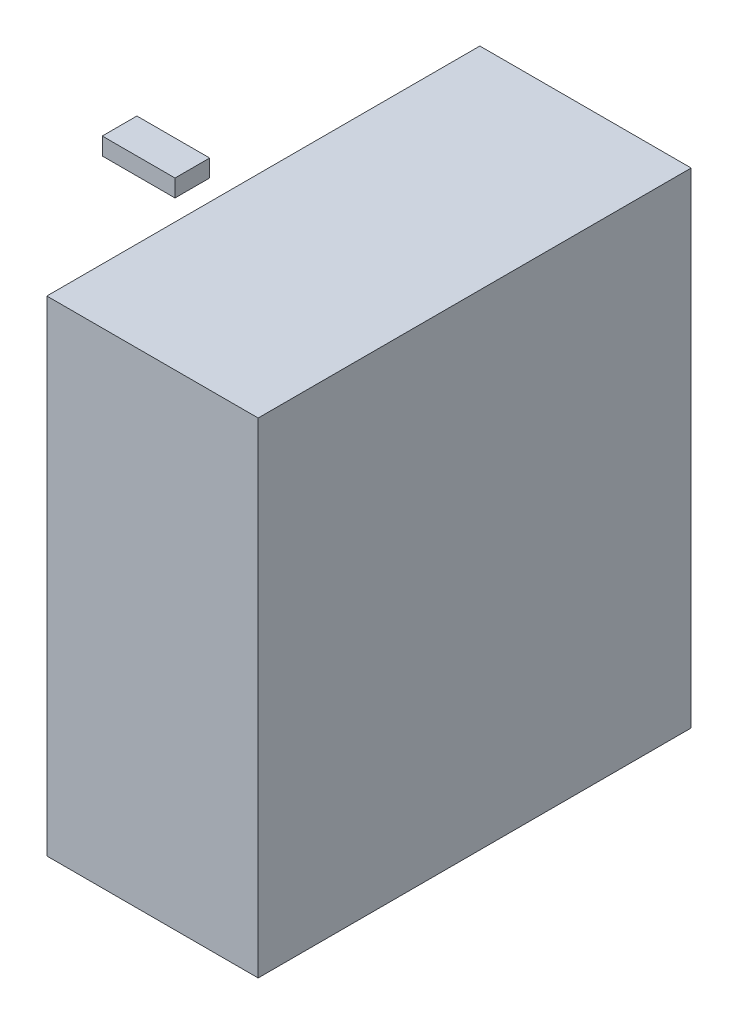
ISO-10303-21;
HEADER;
FILE_DESCRIPTION(('STEP AP214'),'2;1');
FILE_NAME('part.step','',(''),(''),'','','');
FILE_SCHEMA(('AUTOMOTIVE_DESIGN { 1 0 10303 214 1 1 1 1 }'));
ENDSEC;
DATA;
#1=APPLICATION_CONTEXT('core data for automotive mechanical design processes');
#2=APPLICATION_PROTOCOL_DEFINITION('international standard','automotive_design',2000,#1);
#3=PRODUCT_CONTEXT('',#1,'mechanical');
#4=PRODUCT('Part','Part','',(#3));
#5=PRODUCT_RELATED_PRODUCT_CATEGORY('part','',(#4));
#6=PRODUCT_DEFINITION_FORMATION('','',#4);
#7=PRODUCT_DEFINITION_CONTEXT('part definition',#1,'design');
#8=PRODUCT_DEFINITION('design','',#6,#7);
#9=PRODUCT_DEFINITION_SHAPE('','',#8);
#10=(LENGTH_UNIT() NAMED_UNIT(*) SI_UNIT(.MILLI.,.METRE.));
#11=(NAMED_UNIT(*) PLANE_ANGLE_UNIT() SI_UNIT($,.RADIAN.));
#12=(NAMED_UNIT(*) SI_UNIT($,.STERADIAN.) SOLID_ANGLE_UNIT());
#13=UNCERTAINTY_MEASURE_WITH_UNIT(LENGTH_MEASURE(1.E-05),#10,'distance_accuracy_value','');
#14=(GEOMETRIC_REPRESENTATION_CONTEXT(3) GLOBAL_UNCERTAINTY_ASSIGNED_CONTEXT((#13)) GLOBAL_UNIT_ASSIGNED_CONTEXT((#10,
#11,#12)) REPRESENTATION_CONTEXT('',''));
#15=CARTESIAN_POINT('',(0.,0.,0.));
#16=DIRECTION('',(0.,0.,1.));
#17=DIRECTION('',(1.,0.,0.));
#18=AXIS2_PLACEMENT_3D('',#15,#16,#17);
#19=CARTESIAN_POINT('',(0.,15.1,0.));
#20=DIRECTION('',(1.,0.,0.));
#21=DIRECTION('',(0.,0.,-1.));
#22=AXIS2_PLACEMENT_3D('',#19,#20,#21);
#23=PLANE('',#22);
#24=DIRECTION('',(0.,0.,1.));
#25=VECTOR('',#24,1.);
#26=CARTESIAN_POINT('',(0.,14.6,0.));
#27=LINE('',#26,#25);
#28=CARTESIAN_POINT('',(0.,14.6,7.8));
#29=VERTEX_POINT('',#28);
#30=CARTESIAN_POINT('',(0.,14.6,8.8));
#31=VERTEX_POINT('',#30);
#32=EDGE_CURVE('E114',#29,#31,#27,.T.);
#33=ORIENTED_EDGE('',*,*,#32,.F.);
#34=DIRECTION('',(0.,-1.,0.));
#35=VECTOR('',#34,1.);
#36=CARTESIAN_POINT('',(0.,15.1,7.8));
#37=LINE('',#36,#35);
#38=CARTESIAN_POINT('',(0.,15.1,7.8));
#39=VERTEX_POINT('',#38);
#40=EDGE_CURVE('E12',#39,#29,#37,.T.);
#41=ORIENTED_EDGE('',*,*,#40,.F.);
#42=DIRECTION('',(0.,0.,1.));
#43=VECTOR('',#42,1.);
#44=CARTESIAN_POINT('',(0.,15.1,0.));
#45=LINE('',#44,#43);
#46=CARTESIAN_POINT('',(0.,15.1,8.8));
#47=VERTEX_POINT('',#46);
#48=EDGE_CURVE('E108',#39,#47,#45,.T.);
#49=ORIENTED_EDGE('',*,*,#48,.T.);
#50=DIRECTION('',(0.,-1.,0.));
#51=VECTOR('',#50,1.);
#52=CARTESIAN_POINT('',(0.,15.1,8.8));
#53=LINE('',#52,#51);
#54=EDGE_CURVE('E89',#47,#31,#53,.T.);
#55=ORIENTED_EDGE('',*,*,#54,.T.);
#56=EDGE_LOOP('',(#33,#41,#49,#55));
#57=FACE_BOUND('',#56,.T.);
#58=ADVANCED_FACE('F51',(#57),#23,.T.);
#59=CARTESIAN_POINT('',(0.,15.1,7.8));
#60=DIRECTION('',(0.,0.,-1.));
#61=DIRECTION('',(-1.,0.,0.));
#62=AXIS2_PLACEMENT_3D('',#59,#60,#61);
#63=PLANE('',#62);
#64=DIRECTION('',(1.,0.,0.));
#65=VECTOR('',#64,1.);
#66=CARTESIAN_POINT('',(0.,14.6,7.8));
#67=LINE('',#66,#65);
#68=CARTESIAN_POINT('',(-2.1,14.6,7.8));
#69=VERTEX_POINT('',#68);
#70=EDGE_CURVE('E102',#69,#29,#67,.T.);
#71=ORIENTED_EDGE('',*,*,#70,.F.);
#72=DIRECTION('',(0.,-1.,0.));
#73=VECTOR('',#72,1.);
#74=CARTESIAN_POINT('',(-2.1,15.1,7.8));
#75=LINE('',#74,#73);
#76=CARTESIAN_POINT('',(-2.1,15.1,7.8));
#77=VERTEX_POINT('',#76);
#78=EDGE_CURVE('E59',#77,#69,#75,.T.);
#79=ORIENTED_EDGE('',*,*,#78,.F.);
#80=DIRECTION('',(1.,0.,0.));
#81=VECTOR('',#80,1.);
#82=CARTESIAN_POINT('',(0.,15.1,7.8));
#83=LINE('',#82,#81);
#84=EDGE_CURVE('E100',#77,#39,#83,.T.);
#85=ORIENTED_EDGE('',*,*,#84,.T.);
#86=ORIENTED_EDGE('',*,*,#40,.T.);
#87=EDGE_LOOP('',(#71,#79,#85,#86));
#88=FACE_BOUND('',#87,.T.);
#89=ADVANCED_FACE('F98',(#88),#63,.T.);
#90=CARTESIAN_POINT('',(-2.1,15.1,0.));
#91=DIRECTION('',(1.,0.,0.));
#92=DIRECTION('',(0.,0.,-1.));
#93=AXIS2_PLACEMENT_3D('',#90,#91,#92);
#94=PLANE('',#93);
#95=DIRECTION('',(0.,0.,1.));
#96=VECTOR('',#95,1.);
#97=CARTESIAN_POINT('',(-2.1,14.6,0.));
#98=LINE('',#97,#96);
#99=CARTESIAN_POINT('',(-2.1,14.6,8.8));
#100=VERTEX_POINT('',#99);
#101=EDGE_CURVE('E82',#69,#100,#98,.T.);
#102=ORIENTED_EDGE('',*,*,#101,.T.);
#103=DIRECTION('',(0.,-1.,0.));
#104=VECTOR('',#103,1.);
#105=CARTESIAN_POINT('',(-2.1,15.1,8.8));
#106=LINE('',#105,#104);
#107=CARTESIAN_POINT('',(-2.1,15.1,8.8));
#108=VERTEX_POINT('',#107);
#109=EDGE_CURVE('E103',#108,#100,#106,.T.);
#110=ORIENTED_EDGE('',*,*,#109,.F.);
#111=DIRECTION('',(0.,0.,1.));
#112=VECTOR('',#111,1.);
#113=CARTESIAN_POINT('',(-2.1,15.1,0.));
#114=LINE('',#113,#112);
#115=EDGE_CURVE('E104',#77,#108,#114,.T.);
#116=ORIENTED_EDGE('',*,*,#115,.F.);
#117=ORIENTED_EDGE('',*,*,#78,.T.);
#118=EDGE_LOOP('',(#102,#110,#116,#117));
#119=FACE_BOUND('',#118,.T.);
#120=ADVANCED_FACE('F105',(#119),#94,.F.);
#121=CARTESIAN_POINT('',(0.,15.1,8.8));
#122=DIRECTION('',(0.,0.,-1.));
#123=DIRECTION('',(-1.,0.,0.));
#124=AXIS2_PLACEMENT_3D('',#121,#122,#123);
#125=PLANE('',#124);
#126=DIRECTION('',(1.,0.,0.));
#127=VECTOR('',#126,1.);
#128=CARTESIAN_POINT('',(0.,14.6,8.8));
#129=LINE('',#128,#127);
#130=EDGE_CURVE('E110',#100,#31,#129,.T.);
#131=ORIENTED_EDGE('',*,*,#130,.T.);
#132=ORIENTED_EDGE('',*,*,#54,.F.);
#133=DIRECTION('',(1.,0.,0.));
#134=VECTOR('',#133,1.);
#135=CARTESIAN_POINT('',(0.,15.1,8.8));
#136=LINE('',#135,#134);
#137=EDGE_CURVE('E67',#108,#47,#136,.T.);
#138=ORIENTED_EDGE('',*,*,#137,.F.);
#139=ORIENTED_EDGE('',*,*,#109,.T.);
#140=EDGE_LOOP('',(#131,#132,#138,#139));
#141=FACE_BOUND('',#140,.T.);
#142=ADVANCED_FACE('F123',(#141),#125,.F.);
#143=CARTESIAN_POINT('',(0.,15.1,0.));
#144=DIRECTION('',(0.,1.,0.));
#145=DIRECTION('',(0.,0.,1.));
#146=AXIS2_PLACEMENT_3D('',#143,#144,#145);
#147=PLANE('',#146);
#148=ORIENTED_EDGE('',*,*,#48,.F.);
#149=ORIENTED_EDGE('',*,*,#84,.F.);
#150=ORIENTED_EDGE('',*,*,#115,.T.);
#151=ORIENTED_EDGE('',*,*,#137,.T.);
#152=EDGE_LOOP('',(#148,#149,#150,#151));
#153=FACE_BOUND('',#152,.T.);
#154=ADVANCED_FACE('F107',(#153),#147,.T.);
#155=CARTESIAN_POINT('',(0.,14.6,0.));
#156=DIRECTION('',(0.,1.,0.));
#157=DIRECTION('',(0.,0.,1.));
#158=AXIS2_PLACEMENT_3D('',#155,#156,#157);
#159=PLANE('',#158);
#160=ORIENTED_EDGE('',*,*,#32,.T.);
#161=ORIENTED_EDGE('',*,*,#130,.F.);
#162=ORIENTED_EDGE('',*,*,#101,.F.);
#163=ORIENTED_EDGE('',*,*,#70,.T.);
#164=EDGE_LOOP('',(#160,#161,#162,#163));
#165=FACE_BOUND('',#164,.T.);
#166=ADVANCED_FACE('F125',(#165),#159,.F.);
#167=CLOSED_SHELL('',(#58,#89,#120,#142,#154,#166));
#168=MANIFOLD_SOLID_BREP('B2',#167);
#169=CARTESIAN_POINT('',(0.,-1.1,0.));
#170=DIRECTION('',(-1.,0.,0.));
#171=DIRECTION('',(0.,0.,1.));
#172=AXIS2_PLACEMENT_3D('',#169,#170,#171);
#173=PLANE('',#172);
#174=DIRECTION('',(0.,0.,1.));
#175=VECTOR('',#174,1.);
#176=CARTESIAN_POINT('',(0.,-0.6,0.));
#177=LINE('',#176,#175);
#178=CARTESIAN_POINT('',(0.,-0.6,7.8));
#179=VERTEX_POINT('',#178);
#180=CARTESIAN_POINT('',(0.,-0.6,8.8));
#181=VERTEX_POINT('',#180);
#182=EDGE_CURVE('E260',#179,#181,#177,.T.);
#183=ORIENTED_EDGE('',*,*,#182,.T.);
#184=DIRECTION('',(0.,1.,0.));
#185=VECTOR('',#184,1.);
#186=CARTESIAN_POINT('',(0.,-1.1,8.8));
#187=LINE('',#186,#185);
#188=CARTESIAN_POINT('',(0.,-1.1,8.8));
#189=VERTEX_POINT('',#188);
#190=EDGE_CURVE('E49',#189,#181,#187,.T.);
#191=ORIENTED_EDGE('',*,*,#190,.F.);
#192=DIRECTION('',(0.,0.,1.));
#193=VECTOR('',#192,1.);
#194=CARTESIAN_POINT('',(0.,-1.1,0.));
#195=LINE('',#194,#193);
#196=CARTESIAN_POINT('',(0.,-1.1,7.8));
#197=VERTEX_POINT('',#196);
#198=EDGE_CURVE('E216',#197,#189,#195,.T.);
#199=ORIENTED_EDGE('',*,*,#198,.F.);
#200=DIRECTION('',(0.,1.,0.));
#201=VECTOR('',#200,1.);
#202=CARTESIAN_POINT('',(0.,-1.1,7.8));
#203=LINE('',#202,#201);
#204=EDGE_CURVE('E201',#197,#179,#203,.T.);
#205=ORIENTED_EDGE('',*,*,#204,.T.);
#206=EDGE_LOOP('',(#183,#191,#199,#205));
#207=FACE_BOUND('',#206,.T.);
#208=ADVANCED_FACE('F198',(#207),#173,.F.);
#209=CARTESIAN_POINT('',(0.,-1.1,8.8));
#210=DIRECTION('',(0.,0.,1.));
#211=DIRECTION('',(1.,0.,0.));
#212=AXIS2_PLACEMENT_3D('',#209,#210,#211);
#213=PLANE('',#212);
#214=DIRECTION('',(1.,0.,0.));
#215=VECTOR('',#214,1.);
#216=CARTESIAN_POINT('',(0.,-0.6,8.8));
#217=LINE('',#216,#215);
#218=CARTESIAN_POINT('',(-2.1,-0.6,8.8));
#219=VERTEX_POINT('',#218);
#220=EDGE_CURVE('E265',#219,#181,#217,.T.);
#221=ORIENTED_EDGE('',*,*,#220,.F.);
#222=DIRECTION('',(0.,1.,0.));
#223=VECTOR('',#222,1.);
#224=CARTESIAN_POINT('',(-2.1,-1.1,8.8));
#225=LINE('',#224,#223);
#226=CARTESIAN_POINT('',(-2.1,-1.1,8.8));
#227=VERTEX_POINT('',#226);
#228=EDGE_CURVE('E207',#227,#219,#225,.T.);
#229=ORIENTED_EDGE('',*,*,#228,.F.);
#230=DIRECTION('',(1.,0.,0.));
#231=VECTOR('',#230,1.);
#232=CARTESIAN_POINT('',(0.,-1.1,8.8));
#233=LINE('',#232,#231);
#234=EDGE_CURVE('E255',#227,#189,#233,.T.);
#235=ORIENTED_EDGE('',*,*,#234,.T.);
#236=ORIENTED_EDGE('',*,*,#190,.T.);
#237=EDGE_LOOP('',(#221,#229,#235,#236));
#238=FACE_BOUND('',#237,.T.);
#239=ADVANCED_FACE('F271',(#238),#213,.T.);
#240=CARTESIAN_POINT('',(-2.1,-1.1,0.));
#241=DIRECTION('',(-1.,0.,0.));
#242=DIRECTION('',(0.,0.,1.));
#243=AXIS2_PLACEMENT_3D('',#240,#241,#242);
#244=PLANE('',#243);
#245=DIRECTION('',(0.,0.,1.));
#246=VECTOR('',#245,1.);
#247=CARTESIAN_POINT('',(-2.1,-0.6,0.));
#248=LINE('',#247,#246);
#249=CARTESIAN_POINT('',(-2.1,-0.6,7.8));
#250=VERTEX_POINT('',#249);
#251=EDGE_CURVE('E248',#250,#219,#248,.T.);
#252=ORIENTED_EDGE('',*,*,#251,.F.);
#253=DIRECTION('',(0.,1.,0.));
#254=VECTOR('',#253,1.);
#255=CARTESIAN_POINT('',(-2.1,-1.1,7.8));
#256=LINE('',#255,#254);
#257=CARTESIAN_POINT('',(-2.1,-1.1,7.8));
#258=VERTEX_POINT('',#257);
#259=EDGE_CURVE('E245',#258,#250,#256,.T.);
#260=ORIENTED_EDGE('',*,*,#259,.F.);
#261=DIRECTION('',(0.,0.,1.));
#262=VECTOR('',#261,1.);
#263=CARTESIAN_POINT('',(-2.1,-1.1,0.));
#264=LINE('',#263,#262);
#265=EDGE_CURVE('E247',#258,#227,#264,.T.);
#266=ORIENTED_EDGE('',*,*,#265,.T.);
#267=ORIENTED_EDGE('',*,*,#228,.T.);
#268=EDGE_LOOP('',(#252,#260,#266,#267));
#269=FACE_BOUND('',#268,.T.);
#270=ADVANCED_FACE('F246',(#269),#244,.T.);
#271=CARTESIAN_POINT('',(0.,-1.1,7.8));
#272=DIRECTION('',(0.,0.,1.));
#273=DIRECTION('',(1.,0.,0.));
#274=AXIS2_PLACEMENT_3D('',#271,#272,#273);
#275=PLANE('',#274);
#276=DIRECTION('',(1.,0.,0.));
#277=VECTOR('',#276,1.);
#278=CARTESIAN_POINT('',(0.,-0.6,7.8));
#279=LINE('',#278,#277);
#280=EDGE_CURVE('E262',#250,#179,#279,.T.);
#281=ORIENTED_EDGE('',*,*,#280,.T.);
#282=ORIENTED_EDGE('',*,*,#204,.F.);
#283=DIRECTION('',(1.,0.,0.));
#284=VECTOR('',#283,1.);
#285=CARTESIAN_POINT('',(0.,-1.1,7.8));
#286=LINE('',#285,#284);
#287=EDGE_CURVE('E242',#258,#197,#286,.T.);
#288=ORIENTED_EDGE('',*,*,#287,.F.);
#289=ORIENTED_EDGE('',*,*,#259,.T.);
#290=EDGE_LOOP('',(#281,#282,#288,#289));
#291=FACE_BOUND('',#290,.T.);
#292=ADVANCED_FACE('F251',(#291),#275,.F.);
#293=CARTESIAN_POINT('',(0.,-1.1,0.));
#294=DIRECTION('',(0.,1.,0.));
#295=DIRECTION('',(0.,0.,1.));
#296=AXIS2_PLACEMENT_3D('',#293,#294,#295);
#297=PLANE('',#296);
#298=ORIENTED_EDGE('',*,*,#198,.T.);
#299=ORIENTED_EDGE('',*,*,#234,.F.);
#300=ORIENTED_EDGE('',*,*,#265,.F.);
#301=ORIENTED_EDGE('',*,*,#287,.T.);
#302=EDGE_LOOP('',(#298,#299,#300,#301));
#303=FACE_BOUND('',#302,.T.);
#304=ADVANCED_FACE('F254',(#303),#297,.F.);
#305=CARTESIAN_POINT('',(0.,-0.6,0.));
#306=DIRECTION('',(0.,1.,0.));
#307=DIRECTION('',(0.,0.,1.));
#308=AXIS2_PLACEMENT_3D('',#305,#306,#307);
#309=PLANE('',#308);
#310=ORIENTED_EDGE('',*,*,#182,.F.);
#311=ORIENTED_EDGE('',*,*,#280,.F.);
#312=ORIENTED_EDGE('',*,*,#251,.T.);
#313=ORIENTED_EDGE('',*,*,#220,.T.);
#314=EDGE_LOOP('',(#310,#311,#312,#313));
#315=FACE_BOUND('',#314,.T.);
#316=ADVANCED_FACE('F270',(#315),#309,.T.);
#317=CLOSED_SHELL('',(#208,#239,#270,#292,#304,#316));
#318=MANIFOLD_SOLID_BREP('B6',#317);
#319=CARTESIAN_POINT('',(6.1,14.,0.));
#320=DIRECTION('',(1.,0.,0.));
#321=DIRECTION('',(0.,0.,-1.));
#322=AXIS2_PLACEMENT_3D('',#319,#320,#321);
#323=PLANE('',#322);
#324=DIRECTION('',(0.,0.,1.));
#325=VECTOR('',#324,1.);
#326=CARTESIAN_POINT('',(6.1,0.,0.));
#327=LINE('',#326,#325);
#328=CARTESIAN_POINT('',(6.1,0.,0.));
#329=VERTEX_POINT('',#328);
#330=CARTESIAN_POINT('',(6.1,0.,12.5));
#331=VERTEX_POINT('',#330);
#332=EDGE_CURVE('E399',#329,#331,#327,.T.);
#333=ORIENTED_EDGE('',*,*,#332,.F.);
#334=DIRECTION('',(0.,-1.,0.));
#335=VECTOR('',#334,1.);
#336=CARTESIAN_POINT('',(6.1,14.,0.));
#337=LINE('',#336,#335);
#338=CARTESIAN_POINT('',(6.1,14.,0.));
#339=VERTEX_POINT('',#338);
#340=EDGE_CURVE('E196',#339,#329,#337,.T.);
#341=ORIENTED_EDGE('',*,*,#340,.F.);
#342=DIRECTION('',(0.,0.,1.));
#343=VECTOR('',#342,1.);
#344=CARTESIAN_POINT('',(6.1,14.,0.));
#345=LINE('',#344,#343);
#346=CARTESIAN_POINT('',(6.1,14.,12.5));
#347=VERTEX_POINT('',#346);
#348=EDGE_CURVE('E393',#339,#347,#345,.T.);
#349=ORIENTED_EDGE('',*,*,#348,.T.);
#350=DIRECTION('',(0.,-1.,0.));
#351=VECTOR('',#350,1.);
#352=CARTESIAN_POINT('',(6.1,14.,12.5));
#353=LINE('',#352,#351);
#354=EDGE_CURVE('E374',#347,#331,#353,.T.);
#355=ORIENTED_EDGE('',*,*,#354,.T.);
#356=EDGE_LOOP('',(#333,#341,#349,#355));
#357=FACE_BOUND('',#356,.T.);
#358=ADVANCED_FACE('F336',(#357),#323,.T.);
#359=CARTESIAN_POINT('',(0.,14.,0.));
#360=DIRECTION('',(0.,0.,-1.));
#361=DIRECTION('',(-1.,0.,0.));
#362=AXIS2_PLACEMENT_3D('',#359,#360,#361);
#363=PLANE('',#362);
#364=DIRECTION('',(1.,0.,0.));
#365=VECTOR('',#364,1.);
#366=CARTESIAN_POINT('',(0.,0.,0.));
#367=LINE('',#366,#365);
#368=CARTESIAN_POINT('',(0.,0.,0.));
#369=VERTEX_POINT('',#368);
#370=EDGE_CURVE('E387',#369,#329,#367,.T.);
#371=ORIENTED_EDGE('',*,*,#370,.F.);
#372=DIRECTION('',(0.,-1.,0.));
#373=VECTOR('',#372,1.);
#374=CARTESIAN_POINT('',(0.,14.,0.));
#375=LINE('',#374,#373);
#376=CARTESIAN_POINT('',(0.,14.,0.));
#377=VERTEX_POINT('',#376);
#378=EDGE_CURVE('E344',#377,#369,#375,.T.);
#379=ORIENTED_EDGE('',*,*,#378,.F.);
#380=DIRECTION('',(1.,0.,0.));
#381=VECTOR('',#380,1.);
#382=CARTESIAN_POINT('',(0.,14.,0.));
#383=LINE('',#382,#381);
#384=EDGE_CURVE('E385',#377,#339,#383,.T.);
#385=ORIENTED_EDGE('',*,*,#384,.T.);
#386=ORIENTED_EDGE('',*,*,#340,.T.);
#387=EDGE_LOOP('',(#371,#379,#385,#386));
#388=FACE_BOUND('',#387,.T.);
#389=ADVANCED_FACE('F383',(#388),#363,.T.);
#390=CARTESIAN_POINT('',(0.,14.,0.));
#391=DIRECTION('',(1.,0.,0.));
#392=DIRECTION('',(0.,0.,-1.));
#393=AXIS2_PLACEMENT_3D('',#390,#391,#392);
#394=PLANE('',#393);
#395=DIRECTION('',(0.,0.,1.));
#396=VECTOR('',#395,1.);
#397=CARTESIAN_POINT('',(0.,0.,0.));
#398=LINE('',#397,#396);
#399=CARTESIAN_POINT('',(0.,0.,12.5));
#400=VERTEX_POINT('',#399);
#401=EDGE_CURVE('E367',#369,#400,#398,.T.);
#402=ORIENTED_EDGE('',*,*,#401,.T.);
#403=DIRECTION('',(0.,-1.,0.));
#404=VECTOR('',#403,1.);
#405=CARTESIAN_POINT('',(0.,14.,12.5));
#406=LINE('',#405,#404);
#407=CARTESIAN_POINT('',(0.,14.,12.5));
#408=VERTEX_POINT('',#407);
#409=EDGE_CURVE('E388',#408,#400,#406,.T.);
#410=ORIENTED_EDGE('',*,*,#409,.F.);
#411=DIRECTION('',(0.,0.,1.));
#412=VECTOR('',#411,1.);
#413=CARTESIAN_POINT('',(0.,14.,0.));
#414=LINE('',#413,#412);
#415=EDGE_CURVE('E389',#377,#408,#414,.T.);
#416=ORIENTED_EDGE('',*,*,#415,.F.);
#417=ORIENTED_EDGE('',*,*,#378,.T.);
#418=EDGE_LOOP('',(#402,#410,#416,#417));
#419=FACE_BOUND('',#418,.T.);
#420=ADVANCED_FACE('F390',(#419),#394,.F.);
#421=CARTESIAN_POINT('',(0.,14.,12.5));
#422=DIRECTION('',(0.,0.,-1.));
#423=DIRECTION('',(-1.,0.,0.));
#424=AXIS2_PLACEMENT_3D('',#421,#422,#423);
#425=PLANE('',#424);
#426=DIRECTION('',(1.,0.,0.));
#427=VECTOR('',#426,1.);
#428=CARTESIAN_POINT('',(0.,0.,12.5));
#429=LINE('',#428,#427);
#430=EDGE_CURVE('E395',#400,#331,#429,.T.);
#431=ORIENTED_EDGE('',*,*,#430,.T.);
#432=ORIENTED_EDGE('',*,*,#354,.F.);
#433=DIRECTION('',(1.,0.,0.));
#434=VECTOR('',#433,1.);
#435=CARTESIAN_POINT('',(0.,14.,12.5));
#436=LINE('',#435,#434);
#437=EDGE_CURVE('E352',#408,#347,#436,.T.);
#438=ORIENTED_EDGE('',*,*,#437,.F.);
#439=ORIENTED_EDGE('',*,*,#409,.T.);
#440=EDGE_LOOP('',(#431,#432,#438,#439));
#441=FACE_BOUND('',#440,.T.);
#442=ADVANCED_FACE('F408',(#441),#425,.F.);
#443=CARTESIAN_POINT('',(0.,14.,0.));
#444=DIRECTION('',(0.,1.,0.));
#445=DIRECTION('',(0.,0.,1.));
#446=AXIS2_PLACEMENT_3D('',#443,#444,#445);
#447=PLANE('',#446);
#448=ORIENTED_EDGE('',*,*,#348,.F.);
#449=ORIENTED_EDGE('',*,*,#384,.F.);
#450=ORIENTED_EDGE('',*,*,#415,.T.);
#451=ORIENTED_EDGE('',*,*,#437,.T.);
#452=EDGE_LOOP('',(#448,#449,#450,#451));
#453=FACE_BOUND('',#452,.T.);
#454=ADVANCED_FACE('F392',(#453),#447,.T.);
#455=CARTESIAN_POINT('',(0.,0.,0.));
#456=DIRECTION('',(0.,1.,0.));
#457=DIRECTION('',(0.,0.,1.));
#458=AXIS2_PLACEMENT_3D('',#455,#456,#457);
#459=PLANE('',#458);
#460=ORIENTED_EDGE('',*,*,#332,.T.);
#461=ORIENTED_EDGE('',*,*,#430,.F.);
#462=ORIENTED_EDGE('',*,*,#401,.F.);
#463=ORIENTED_EDGE('',*,*,#370,.T.);
#464=EDGE_LOOP('',(#460,#461,#462,#463));
#465=FACE_BOUND('',#464,.T.);
#466=ADVANCED_FACE('F410',(#465),#459,.F.);
#467=CLOSED_SHELL('',(#358,#389,#420,#442,#454,#466));
#468=MANIFOLD_SOLID_BREP('B43',#467);
#469=ADVANCED_BREP_SHAPE_REPRESENTATION('',(#18,#168,#318,#468),#14);
#470=SHAPE_DEFINITION_REPRESENTATION(#9,#469);
ENDSEC;
END-ISO-10303-21;
